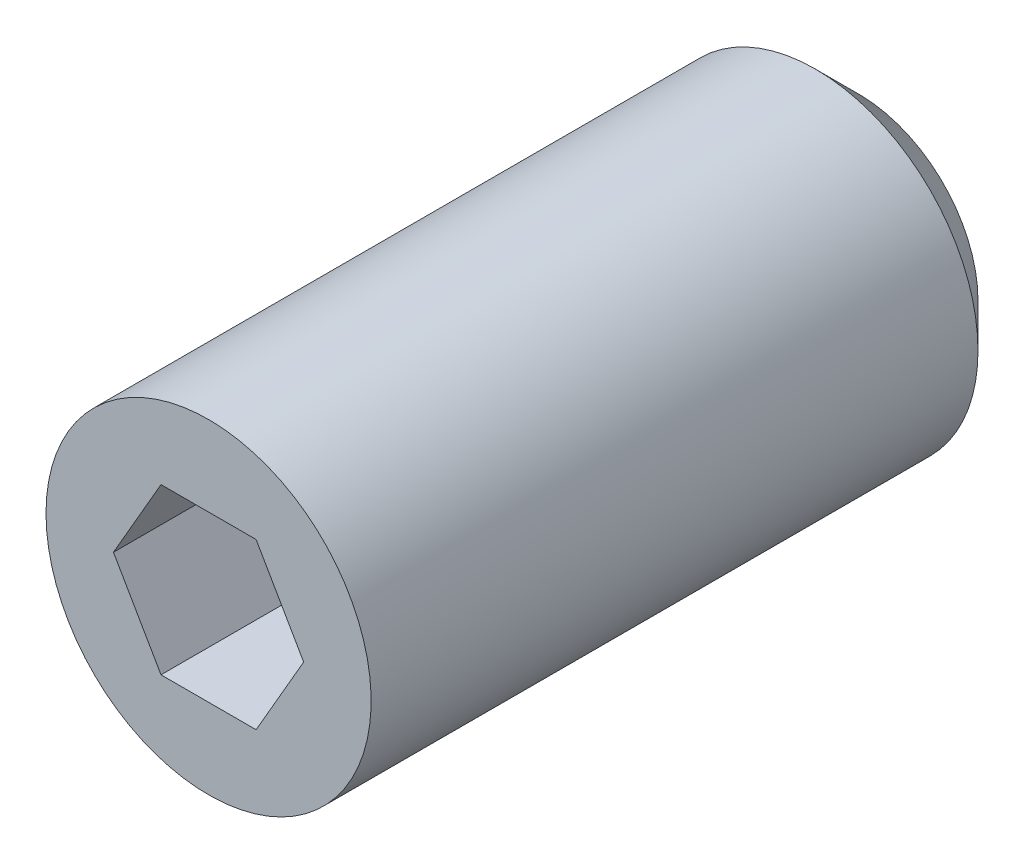
ISO-10303-21;
HEADER;
FILE_DESCRIPTION(('STEP AP214'),'2;1');
FILE_NAME('part.step','',(''),(''),'','','');
FILE_SCHEMA(('AUTOMOTIVE_DESIGN { 1 0 10303 214 1 1 1 1 }'));
ENDSEC;
DATA;
#1=APPLICATION_CONTEXT('core data for automotive mechanical design processes');
#2=APPLICATION_PROTOCOL_DEFINITION('international standard','automotive_design',2000,#1);
#3=PRODUCT_CONTEXT('',#1,'mechanical');
#4=PRODUCT('Part','Part','',(#3));
#5=PRODUCT_RELATED_PRODUCT_CATEGORY('part','',(#4));
#6=PRODUCT_DEFINITION_FORMATION('','',#4);
#7=PRODUCT_DEFINITION_CONTEXT('part definition',#1,'design');
#8=PRODUCT_DEFINITION('design','',#6,#7);
#9=PRODUCT_DEFINITION_SHAPE('','',#8);
#10=(LENGTH_UNIT() NAMED_UNIT(*) SI_UNIT(.MILLI.,.METRE.));
#11=(NAMED_UNIT(*) PLANE_ANGLE_UNIT() SI_UNIT($,.RADIAN.));
#12=(NAMED_UNIT(*) SI_UNIT($,.STERADIAN.) SOLID_ANGLE_UNIT());
#13=UNCERTAINTY_MEASURE_WITH_UNIT(LENGTH_MEASURE(1.E-05),#10,'distance_accuracy_value','');
#14=(GEOMETRIC_REPRESENTATION_CONTEXT(3) GLOBAL_UNCERTAINTY_ASSIGNED_CONTEXT((#13)) GLOBAL_UNIT_ASSIGNED_CONTEXT((#10,
#11,#12)) REPRESENTATION_CONTEXT('',''));
#15=CARTESIAN_POINT('',(0.,0.,0.));
#16=DIRECTION('',(0.,0.,1.));
#17=DIRECTION('',(1.,0.,0.));
#18=AXIS2_PLACEMENT_3D('',#15,#16,#17);
#19=CARTESIAN_POINT('',(0.438786205,0.76,3.8));
#20=DIRECTION('',(0.,1.,0.));
#21=DIRECTION('',(-1.,0.,0.));
#22=AXIS2_PLACEMENT_3D('',#19,#20,#21);
#23=PLANE('',#22);
#24=DIRECTION('',(0.,0.,-1.));
#25=VECTOR('',#24,1.);
#26=CARTESIAN_POINT('',(-0.438786205,0.76,4.9));
#27=LINE('',#26,#25);
#28=CARTESIAN_POINT('',(-0.438786204615,0.760000000179,6.));
#29=VERTEX_POINT('',#28);
#30=CARTESIAN_POINT('',(-0.438786204875,0.76,3.8));
#31=VERTEX_POINT('',#30);
#32=EDGE_CURVE('E104',#29,#31,#27,.T.);
#33=ORIENTED_EDGE('',*,*,#32,.T.);
#34=DIRECTION('',(-1.,0.,0.));
#35=VECTOR('',#34,1.);
#36=CARTESIAN_POINT('',(0.,0.76,3.8));
#37=LINE('',#36,#35);
#38=CARTESIAN_POINT('',(0.438786205,0.76,3.8));
#39=VERTEX_POINT('',#38);
#40=EDGE_CURVE('E68',#39,#31,#37,.T.);
#41=ORIENTED_EDGE('',*,*,#40,.F.);
#42=DIRECTION('',(0.,0.,1.));
#43=VECTOR('',#42,1.);
#44=CARTESIAN_POINT('',(0.438786205,0.76,4.9));
#45=LINE('',#44,#43);
#46=CARTESIAN_POINT('',(0.438786204615,0.760000000179,6.));
#47=VERTEX_POINT('',#46);
#48=EDGE_CURVE('E79',#39,#47,#45,.T.);
#49=ORIENTED_EDGE('',*,*,#48,.T.);
#50=DIRECTION('',(1.,0.,0.));
#51=VECTOR('',#50,1.);
#52=CARTESIAN_POINT('',(0.,0.76,6.));
#53=LINE('',#52,#51);
#54=EDGE_CURVE('E131',#29,#47,#53,.T.);
#55=ORIENTED_EDGE('',*,*,#54,.F.);
#56=EDGE_LOOP('',(#33,#41,#49,#55));
#57=FACE_BOUND('',#56,.T.);
#58=ADVANCED_FACE('F17',(#57),#23,.F.);
#59=CARTESIAN_POINT('',(-0.438786205,0.76,3.8));
#60=DIRECTION('',(-0.866025404072654,0.499999999500797,0.));
#61=DIRECTION('',(-0.499999999500797,-0.866025404072653,0.));
#62=AXIS2_PLACEMENT_3D('',#59,#60,#61);
#63=PLANE('',#62);
#64=DIRECTION('',(0.,0.,-1.));
#65=VECTOR('',#64,1.);
#66=CARTESIAN_POINT('',(-0.877572409,0.,4.9));
#67=LINE('',#66,#65);
#68=CARTESIAN_POINT('',(-0.877572409019896,-3.79500033828584E-10,6.));
#69=VERTEX_POINT('',#68);
#70=CARTESIAN_POINT('',(-0.877572409,0.,3.8));
#71=VERTEX_POINT('',#70);
#72=EDGE_CURVE('E105',#69,#71,#67,.T.);
#73=ORIENTED_EDGE('',*,*,#72,.T.);
#74=DIRECTION('',(-0.499999999500797,-0.866025404072654,0.));
#75=VECTOR('',#74,1.);
#76=CARTESIAN_POINT('',(-0.658179307,0.38,3.8));
#77=LINE('',#76,#75);
#78=EDGE_CURVE('E101',#31,#71,#77,.T.);
#79=ORIENTED_EDGE('',*,*,#78,.F.);
#80=ORIENTED_EDGE('',*,*,#32,.F.);
#81=DIRECTION('',(0.499999999500797,0.866025404072654,0.));
#82=VECTOR('',#81,1.);
#83=CARTESIAN_POINT('',(-0.658179307,0.38,6.));
#84=LINE('',#83,#82);
#85=EDGE_CURVE('E103',#69,#29,#84,.T.);
#86=ORIENTED_EDGE('',*,*,#85,.F.);
#87=EDGE_LOOP('',(#73,#79,#80,#86));
#88=FACE_BOUND('',#87,.T.);
#89=ADVANCED_FACE('F137',(#88),#63,.F.);
#90=CARTESIAN_POINT('',(0.877572409,0.,3.8));
#91=DIRECTION('',(0.866025404072654,0.499999999500797,0.));
#92=DIRECTION('',(-0.499999999500797,0.866025404072653,0.));
#93=AXIS2_PLACEMENT_3D('',#90,#91,#92);
#94=PLANE('',#93);
#95=ORIENTED_EDGE('',*,*,#48,.F.);
#96=DIRECTION('',(-0.499999999500797,0.866025404072653,0.));
#97=VECTOR('',#96,1.);
#98=CARTESIAN_POINT('',(0.877572409,0.,3.8));
#99=LINE('',#98,#97);
#100=CARTESIAN_POINT('',(0.877572409,0.,3.8));
#101=VERTEX_POINT('',#100);
#102=EDGE_CURVE('E21',#39,#101,#99,.F.);
#103=ORIENTED_EDGE('',*,*,#102,.T.);
#104=DIRECTION('',(0.,0.,1.));
#105=VECTOR('',#104,1.);
#106=CARTESIAN_POINT('',(0.877572409,0.,4.9));
#107=LINE('',#106,#105);
#108=CARTESIAN_POINT('',(0.877572409019896,3.79500033828584E-10,6.));
#109=VERTEX_POINT('',#108);
#110=EDGE_CURVE('E78',#101,#109,#107,.T.);
#111=ORIENTED_EDGE('',*,*,#110,.T.);
#112=DIRECTION('',(0.499999999500797,-0.866025404072654,0.));
#113=VECTOR('',#112,1.);
#114=CARTESIAN_POINT('',(0.658179307,0.38,6.));
#115=LINE('',#114,#113);
#116=EDGE_CURVE('E107',#47,#109,#115,.T.);
#117=ORIENTED_EDGE('',*,*,#116,.F.);
#118=EDGE_LOOP('',(#95,#103,#111,#117));
#119=FACE_BOUND('',#118,.T.);
#120=ADVANCED_FACE('F75',(#119),#94,.F.);
#121=CARTESIAN_POINT('',(-0.877572409,0.,3.8));
#122=DIRECTION('',(-0.866025404072654,-0.499999999500797,0.));
#123=DIRECTION('',(0.499999999500797,-0.866025404072653,0.));
#124=AXIS2_PLACEMENT_3D('',#121,#122,#123);
#125=PLANE('',#124);
#126=DIRECTION('',(0.,0.,-1.));
#127=VECTOR('',#126,1.);
#128=CARTESIAN_POINT('',(-0.438786205,-0.76,4.9));
#129=LINE('',#128,#127);
#130=CARTESIAN_POINT('',(-0.438786204615,-0.760000000179,6.));
#131=VERTEX_POINT('',#130);
#132=CARTESIAN_POINT('',(-0.438786205,-0.76,3.8));
#133=VERTEX_POINT('',#132);
#134=EDGE_CURVE('E94',#131,#133,#129,.T.);
#135=ORIENTED_EDGE('',*,*,#134,.T.);
#136=DIRECTION('',(0.499999999500797,-0.866025404072653,0.));
#137=VECTOR('',#136,1.);
#138=CARTESIAN_POINT('',(-0.877572409,0.,3.8));
#139=LINE('',#138,#137);
#140=EDGE_CURVE('E81',#133,#71,#139,.F.);
#141=ORIENTED_EDGE('',*,*,#140,.T.);
#142=ORIENTED_EDGE('',*,*,#72,.F.);
#143=DIRECTION('',(-0.499999999500797,0.866025404072654,0.));
#144=VECTOR('',#143,1.);
#145=CARTESIAN_POINT('',(-0.658179307,-0.38,6.));
#146=LINE('',#145,#144);
#147=EDGE_CURVE('E82',#131,#69,#146,.T.);
#148=ORIENTED_EDGE('',*,*,#147,.F.);
#149=EDGE_LOOP('',(#135,#141,#142,#148));
#150=FACE_BOUND('',#149,.T.);
#151=ADVANCED_FACE('F115',(#150),#125,.F.);
#152=CARTESIAN_POINT('',(0.877572409,-0.76,3.8));
#153=DIRECTION('',(0.,0.,-1.));
#154=DIRECTION('',(-1.,0.,0.));
#155=AXIS2_PLACEMENT_3D('',#152,#153,#154);
#156=PLANE('',#155);
#157=DIRECTION('',(1.,0.,0.));
#158=VECTOR('',#157,1.);
#159=CARTESIAN_POINT('',(0.,-0.76,3.8));
#160=LINE('',#159,#158);
#161=CARTESIAN_POINT('',(0.43878620475,-0.76,3.8));
#162=VERTEX_POINT('',#161);
#163=EDGE_CURVE('E88',#133,#162,#160,.T.);
#164=ORIENTED_EDGE('',*,*,#163,.T.);
#165=DIRECTION('',(0.499999999500797,0.866025404072654,0.));
#166=VECTOR('',#165,1.);
#167=CARTESIAN_POINT('',(0.658179307,-0.38,3.8));
#168=LINE('',#167,#166);
#169=EDGE_CURVE('E84',#162,#101,#168,.T.);
#170=ORIENTED_EDGE('',*,*,#169,.T.);
#171=ORIENTED_EDGE('',*,*,#102,.F.);
#172=ORIENTED_EDGE('',*,*,#40,.T.);
#173=ORIENTED_EDGE('',*,*,#78,.T.);
#174=ORIENTED_EDGE('',*,*,#140,.F.);
#175=EDGE_LOOP('',(#164,#170,#171,#172,#173,#174));
#176=FACE_BOUND('',#175,.T.);
#177=ADVANCED_FACE('F85',(#176),#156,.F.);
#178=CARTESIAN_POINT('',(0.438786205,-0.76,3.8));
#179=DIRECTION('',(0.866025404072654,-0.499999999500797,0.));
#180=DIRECTION('',(0.499999999500797,0.866025404072653,0.));
#181=AXIS2_PLACEMENT_3D('',#178,#179,#180);
#182=PLANE('',#181);
#183=ORIENTED_EDGE('',*,*,#110,.F.);
#184=ORIENTED_EDGE('',*,*,#169,.F.);
#185=DIRECTION('',(0.,0.,1.));
#186=VECTOR('',#185,1.);
#187=CARTESIAN_POINT('',(0.438786205,-0.76,4.9));
#188=LINE('',#187,#186);
#189=CARTESIAN_POINT('',(0.438786204615,-0.760000000179,6.));
#190=VERTEX_POINT('',#189);
#191=EDGE_CURVE('E100',#162,#190,#188,.T.);
#192=ORIENTED_EDGE('',*,*,#191,.T.);
#193=DIRECTION('',(-0.499999999500797,-0.866025404072654,0.));
#194=VECTOR('',#193,1.);
#195=CARTESIAN_POINT('',(0.658179307,-0.38,6.));
#196=LINE('',#195,#194);
#197=EDGE_CURVE('E36',#109,#190,#196,.T.);
#198=ORIENTED_EDGE('',*,*,#197,.F.);
#199=EDGE_LOOP('',(#183,#184,#192,#198));
#200=FACE_BOUND('',#199,.T.);
#201=ADVANCED_FACE('F92',(#200),#182,.F.);
#202=CARTESIAN_POINT('',(-0.438786205,-0.76,6.));
#203=DIRECTION('',(0.,-1.,0.));
#204=DIRECTION('',(0.,0.,-1.));
#205=AXIS2_PLACEMENT_3D('',#202,#203,#204);
#206=PLANE('',#205);
#207=ORIENTED_EDGE('',*,*,#191,.F.);
#208=ORIENTED_EDGE('',*,*,#163,.F.);
#209=ORIENTED_EDGE('',*,*,#134,.F.);
#210=DIRECTION('',(-1.,0.,0.));
#211=VECTOR('',#210,1.);
#212=CARTESIAN_POINT('',(0.,-0.760000000716,6.));
#213=LINE('',#212,#211);
#214=EDGE_CURVE('E111',#190,#131,#213,.T.);
#215=ORIENTED_EDGE('',*,*,#214,.F.);
#216=EDGE_LOOP('',(#207,#208,#209,#215));
#217=FACE_BOUND('',#216,.T.);
#218=ADVANCED_FACE('F119',(#217),#206,.F.);
#219=CARTESIAN_POINT('',(-1.518,-1.518,6.));
#220=DIRECTION('',(0.,0.,1.));
#221=DIRECTION('',(1.,0.,0.));
#222=AXIS2_PLACEMENT_3D('',#219,#220,#221);
#223=PLANE('',#222);
#224=ORIENTED_EDGE('',*,*,#197,.T.);
#225=ORIENTED_EDGE('',*,*,#214,.T.);
#226=ORIENTED_EDGE('',*,*,#147,.T.);
#227=ORIENTED_EDGE('',*,*,#85,.T.);
#228=ORIENTED_EDGE('',*,*,#54,.T.);
#229=ORIENTED_EDGE('',*,*,#116,.T.);
#230=EDGE_LOOP('',(#224,#225,#226,#227,#228,#229));
#231=FACE_BOUND('',#230,.T.);
#232=CARTESIAN_POINT('',(0.,0.,6.));
#233=DIRECTION('',(0.,0.,-1.));
#234=DIRECTION('',(-1.,0.,0.));
#235=AXIS2_PLACEMENT_3D('',#232,#233,#234);
#236=CIRCLE('',#235,1.5);
#237=CARTESIAN_POINT('',(-1.5,0.,6.));
#238=VERTEX_POINT('',#237);
#239=EDGE_CURVE('E109',#238,#238,#236,.F.);
#240=ORIENTED_EDGE('',*,*,#239,.T.);
#241=EDGE_LOOP('',(#240));
#242=FACE_BOUND('',#241,.T.);
#243=ADVANCED_FACE('F133',(#231,#242),#223,.T.);
#244=CARTESIAN_POINT('',(0.,0.,6.));
#245=DIRECTION('',(0.,0.,-1.));
#246=DIRECTION('',(-1.,0.,0.));
#247=AXIS2_PLACEMENT_3D('',#244,#245,#246);
#248=CYLINDRICAL_SURFACE('',#247,1.5);
#249=CARTESIAN_POINT('',(0.,0.,0.399999999999956));
#250=DIRECTION('',(0.,0.,1.));
#251=DIRECTION('',(1.,0.,0.));
#252=AXIS2_PLACEMENT_3D('',#249,#250,#251);
#253=CIRCLE('',#252,1.5);
#254=CARTESIAN_POINT('',(1.5,0.,0.4));
#255=VERTEX_POINT('',#254);
#256=EDGE_CURVE('E27',#255,#255,#253,.T.);
#257=ORIENTED_EDGE('',*,*,#256,.T.);
#258=EDGE_LOOP('',(#257));
#259=FACE_BOUND('',#258,.T.);
#260=ORIENTED_EDGE('',*,*,#239,.F.);
#261=EDGE_LOOP('',(#260));
#262=FACE_BOUND('',#261,.T.);
#263=ADVANCED_FACE('F154',(#259,#262),#248,.T.);
#264=CARTESIAN_POINT('',(-1.1132,-1.1132,0.));
#265=DIRECTION('',(0.,0.,1.));
#266=DIRECTION('',(1.,0.,0.));
#267=AXIS2_PLACEMENT_3D('',#264,#265,#266);
#268=PLANE('',#267);
#269=CARTESIAN_POINT('',(0.,0.,0.));
#270=DIRECTION('',(0.,0.,1.));
#271=DIRECTION('',(1.,0.,0.));
#272=AXIS2_PLACEMENT_3D('',#269,#270,#271);
#273=CIRCLE('',#272,1.1);
#274=CARTESIAN_POINT('',(1.1,0.,0.));
#275=VERTEX_POINT('',#274);
#276=EDGE_CURVE('E11',#275,#275,#273,.F.);
#277=ORIENTED_EDGE('',*,*,#276,.T.);
#278=EDGE_LOOP('',(#277));
#279=FACE_BOUND('',#278,.T.);
#280=ADVANCED_FACE('F19',(#279),#268,.F.);
#281=CARTESIAN_POINT('',(0.,0.,0.));
#282=DIRECTION('',(0.,0.,1.));
#283=DIRECTION('',(1.,0.,0.));
#284=AXIS2_PLACEMENT_3D('',#281,#282,#283);
#285=CONICAL_SURFACE('',#284,1.1,0.785398163397448);
#286=ORIENTED_EDGE('',*,*,#276,.F.);
#287=EDGE_LOOP('',(#286));
#288=FACE_BOUND('',#287,.T.);
#289=ORIENTED_EDGE('',*,*,#256,.F.);
#290=EDGE_LOOP('',(#289));
#291=FACE_BOUND('',#290,.T.);
#292=ADVANCED_FACE('F147',(#288,#291),#285,.T.);
#293=CLOSED_SHELL('',(#58,#89,#120,#151,#177,#201,#218,#243,#263,#280,#292));
#294=MANIFOLD_SOLID_BREP('B1',#293);
#295=ADVANCED_BREP_SHAPE_REPRESENTATION('',(#18,#294),#14);
#296=SHAPE_DEFINITION_REPRESENTATION(#9,#295);
ENDSEC;
END-ISO-10303-21;
